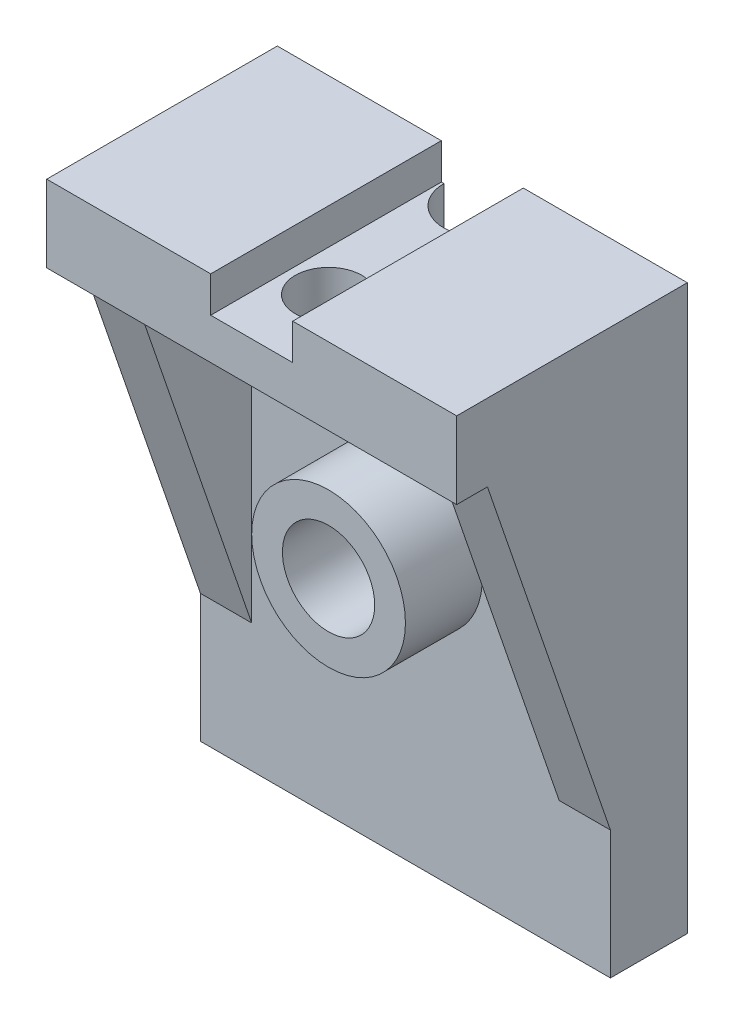
ISO-10303-21;
HEADER;
FILE_DESCRIPTION(('STEP AP214'),'2;1');
FILE_NAME('part.step','',(''),(''),'','','');
FILE_SCHEMA(('AUTOMOTIVE_DESIGN { 1 0 10303 214 1 1 1 1 }'));
ENDSEC;
DATA;
#1=APPLICATION_CONTEXT('core data for automotive mechanical design processes');
#2=APPLICATION_PROTOCOL_DEFINITION('international standard','automotive_design',2000,#1);
#3=PRODUCT_CONTEXT('',#1,'mechanical');
#4=PRODUCT('Part','Part','',(#3));
#5=PRODUCT_RELATED_PRODUCT_CATEGORY('part','',(#4));
#6=PRODUCT_DEFINITION_FORMATION('','',#4);
#7=PRODUCT_DEFINITION_CONTEXT('part definition',#1,'design');
#8=PRODUCT_DEFINITION('design','',#6,#7);
#9=PRODUCT_DEFINITION_SHAPE('','',#8);
#10=(LENGTH_UNIT() NAMED_UNIT(*) SI_UNIT(.MILLI.,.METRE.));
#11=(NAMED_UNIT(*) PLANE_ANGLE_UNIT() SI_UNIT($,.RADIAN.));
#12=(NAMED_UNIT(*) SI_UNIT($,.STERADIAN.) SOLID_ANGLE_UNIT());
#13=UNCERTAINTY_MEASURE_WITH_UNIT(LENGTH_MEASURE(1.E-05),#10,'distance_accuracy_value','');
#14=(GEOMETRIC_REPRESENTATION_CONTEXT(3) GLOBAL_UNCERTAINTY_ASSIGNED_CONTEXT((#13)) GLOBAL_UNIT_ASSIGNED_CONTEXT((#10,
#11,#12)) REPRESENTATION_CONTEXT('',''));
#15=CARTESIAN_POINT('',(0.,0.,0.));
#16=DIRECTION('',(0.,0.,1.));
#17=DIRECTION('',(1.,0.,0.));
#18=AXIS2_PLACEMENT_3D('',#15,#16,#17);
#19=CARTESIAN_POINT('',(-40.,55.,15.));
#20=DIRECTION('',(0.,-1.,0.));
#21=DIRECTION('',(0.,0.,-1.));
#22=AXIS2_PLACEMENT_3D('',#19,#20,#21);
#23=PLANE('',#22);
#24=DIRECTION('',(-1.,0.,0.));
#25=VECTOR('',#24,1.);
#26=CARTESIAN_POINT('',(-40.,55.,0.));
#27=LINE('',#26,#25);
#28=CARTESIAN_POINT('',(40.,55.,0.));
#29=VERTEX_POINT('',#28);
#30=CARTESIAN_POINT('',(8.00000000000001,55.,0.));
#31=VERTEX_POINT('',#30);
#32=EDGE_CURVE('E177',#29,#31,#27,.T.);
#33=ORIENTED_EDGE('',*,*,#32,.T.);
#34=DIRECTION('',(0.,0.,1.));
#35=VECTOR('',#34,1.);
#36=CARTESIAN_POINT('',(8.00000000000001,55.,-0.545006948531608));
#37=LINE('',#36,#35);
#38=CARTESIAN_POINT('',(8.00000000000001,55.,45.));
#39=VERTEX_POINT('',#38);
#40=EDGE_CURVE('E162',#31,#39,#37,.T.);
#41=ORIENTED_EDGE('',*,*,#40,.T.);
#42=DIRECTION('',(-1.,0.,0.));
#43=VECTOR('',#42,1.);
#44=CARTESIAN_POINT('',(40.,55.,45.));
#45=LINE('',#44,#43);
#46=CARTESIAN_POINT('',(40.,55.,45.));
#47=VERTEX_POINT('',#46);
#48=EDGE_CURVE('E175',#47,#39,#45,.T.);
#49=ORIENTED_EDGE('',*,*,#48,.F.);
#50=DIRECTION('',(0.,0.,-1.));
#51=VECTOR('',#50,1.);
#52=CARTESIAN_POINT('',(40.,55.,15.));
#53=LINE('',#52,#51);
#54=EDGE_CURVE('E235',#47,#29,#53,.T.);
#55=ORIENTED_EDGE('',*,*,#54,.T.);
#56=EDGE_LOOP('',(#33,#41,#49,#55));
#57=FACE_BOUND('',#56,.T.);
#58=ADVANCED_FACE('F35',(#57),#23,.F.);
#59=CARTESIAN_POINT('',(0.,0.,0.));
#60=DIRECTION('',(0.,0.,-1.));
#61=DIRECTION('',(-1.,0.,0.));
#62=AXIS2_PLACEMENT_3D('',#59,#60,#61);
#63=PLANE('',#62);
#64=DIRECTION('',(0.,-1.,0.));
#65=VECTOR('',#64,1.);
#66=CARTESIAN_POINT('',(8.00000000000001,0.,0.));
#67=LINE('',#66,#65);
#68=CARTESIAN_POINT('',(8.00000000000001,48.,0.));
#69=VERTEX_POINT('',#68);
#70=EDGE_CURVE('E296',#31,#69,#67,.T.);
#71=ORIENTED_EDGE('',*,*,#70,.F.);
#72=ORIENTED_EDGE('',*,*,#32,.F.);
#73=DIRECTION('',(0.,1.,0.));
#74=VECTOR('',#73,1.);
#75=CARTESIAN_POINT('',(40.,-55.,0.));
#76=LINE('',#75,#74);
#77=CARTESIAN_POINT('',(40.,-55.,0.));
#78=VERTEX_POINT('',#77);
#79=EDGE_CURVE('E215',#78,#29,#76,.T.);
#80=ORIENTED_EDGE('',*,*,#79,.F.);
#81=DIRECTION('',(1.,0.,0.));
#82=VECTOR('',#81,1.);
#83=CARTESIAN_POINT('',(-40.,-55.,0.));
#84=LINE('',#83,#82);
#85=CARTESIAN_POINT('',(7.5,-55.,0.));
#86=VERTEX_POINT('',#85);
#87=EDGE_CURVE('E223',#86,#78,#84,.T.);
#88=ORIENTED_EDGE('',*,*,#87,.F.);
#89=DIRECTION('',(0.,-1.,0.));
#90=VECTOR('',#89,1.);
#91=CARTESIAN_POINT('',(7.5,55.,0.));
#92=LINE('',#91,#90);
#93=CARTESIAN_POINT('',(7.5,-4.9749371855331,0.));
#94=VERTEX_POINT('',#93);
#95=EDGE_CURVE('E307',#94,#86,#92,.T.);
#96=ORIENTED_EDGE('',*,*,#95,.F.);
#97=CARTESIAN_POINT('',(0.,0.,0.));
#98=DIRECTION('',(0.,0.,1.));
#99=DIRECTION('',(1.,0.,0.));
#100=AXIS2_PLACEMENT_3D('',#97,#98,#99);
#101=CIRCLE('',#100,9.);
#102=CARTESIAN_POINT('',(7.5,4.9749371855331,0.));
#103=VERTEX_POINT('',#102);
#104=EDGE_CURVE('E315',#94,#103,#101,.T.);
#105=ORIENTED_EDGE('',*,*,#104,.T.);
#106=CARTESIAN_POINT('',(7.5,48.,0.));
#107=VERTEX_POINT('',#106);
#108=EDGE_CURVE('E310',#107,#103,#92,.T.);
#109=ORIENTED_EDGE('',*,*,#108,.F.);
#110=DIRECTION('',(-1.,0.,0.));
#111=VECTOR('',#110,1.);
#112=CARTESIAN_POINT('',(0.,48.,0.));
#113=LINE('',#112,#111);
#114=EDGE_CURVE('E50',#69,#107,#113,.T.);
#115=ORIENTED_EDGE('',*,*,#114,.F.);
#116=EDGE_LOOP('',(#71,#72,#80,#88,#96,#105,#109,#115));
#117=FACE_BOUND('',#116,.T.);
#118=ADVANCED_FACE('F294',(#117),#63,.T.);
#119=CARTESIAN_POINT('',(0.,0.,15.));
#120=DIRECTION('',(0.,0.,-1.));
#121=DIRECTION('',(-1.,0.,0.));
#122=AXIS2_PLACEMENT_3D('',#119,#120,#121);
#123=PLANE('',#122);
#124=DIRECTION('',(-1.,0.,0.));
#125=VECTOR('',#124,1.);
#126=CARTESIAN_POINT('',(-30.,-30.,15.));
#127=LINE('',#126,#125);
#128=CARTESIAN_POINT('',(-30.,-30.,15.));
#129=VERTEX_POINT('',#128);
#130=CARTESIAN_POINT('',(-40.,-30.,15.));
#131=VERTEX_POINT('',#130);
#132=EDGE_CURVE('E268',#129,#131,#127,.T.);
#133=ORIENTED_EDGE('',*,*,#132,.T.);
#134=DIRECTION('',(0.,-1.,0.));
#135=VECTOR('',#134,1.);
#136=CARTESIAN_POINT('',(-40.,-55.,15.));
#137=LINE('',#136,#135);
#138=CARTESIAN_POINT('',(-40.,-55.,15.));
#139=VERTEX_POINT('',#138);
#140=EDGE_CURVE('E205',#131,#139,#137,.T.);
#141=ORIENTED_EDGE('',*,*,#140,.T.);
#142=DIRECTION('',(1.,0.,0.));
#143=VECTOR('',#142,1.);
#144=CARTESIAN_POINT('',(-40.,-55.,15.));
#145=LINE('',#144,#143);
#146=CARTESIAN_POINT('',(40.,-55.,15.));
#147=VERTEX_POINT('',#146);
#148=EDGE_CURVE('E207',#139,#147,#145,.T.);
#149=ORIENTED_EDGE('',*,*,#148,.T.);
#150=DIRECTION('',(0.,1.,0.));
#151=VECTOR('',#150,1.);
#152=CARTESIAN_POINT('',(40.,-55.,15.));
#153=LINE('',#152,#151);
#154=CARTESIAN_POINT('',(40.,-30.,15.));
#155=VERTEX_POINT('',#154);
#156=EDGE_CURVE('E208',#147,#155,#153,.T.);
#157=ORIENTED_EDGE('',*,*,#156,.T.);
#158=DIRECTION('',(1.,0.,0.));
#159=VECTOR('',#158,1.);
#160=CARTESIAN_POINT('',(30.,-30.,15.));
#161=LINE('',#160,#159);
#162=CARTESIAN_POINT('',(30.,-30.,15.));
#163=VERTEX_POINT('',#162);
#164=EDGE_CURVE('E202',#163,#155,#161,.T.);
#165=ORIENTED_EDGE('',*,*,#164,.F.);
#166=DIRECTION('',(0.,1.,0.));
#167=VECTOR('',#166,1.);
#168=CARTESIAN_POINT('',(30.,-30.,15.));
#169=LINE('',#168,#167);
#170=CARTESIAN_POINT('',(30.,40.,15.));
#171=VERTEX_POINT('',#170);
#172=EDGE_CURVE('E280',#163,#171,#169,.T.);
#173=ORIENTED_EDGE('',*,*,#172,.T.);
#174=DIRECTION('',(1.,0.,0.));
#175=VECTOR('',#174,1.);
#176=CARTESIAN_POINT('',(40.,40.,15.));
#177=LINE('',#176,#175);
#178=CARTESIAN_POINT('',(-30.,40.,15.));
#179=VERTEX_POINT('',#178);
#180=EDGE_CURVE('E199',#179,#171,#177,.T.);
#181=ORIENTED_EDGE('',*,*,#180,.F.);
#182=DIRECTION('',(0.,1.,0.));
#183=VECTOR('',#182,1.);
#184=CARTESIAN_POINT('',(-30.,-30.,15.));
#185=LINE('',#184,#183);
#186=EDGE_CURVE('E324',#129,#179,#185,.T.);
#187=ORIENTED_EDGE('',*,*,#186,.F.);
#188=EDGE_LOOP('',(#133,#141,#149,#157,#165,#173,#181,#187));
#189=FACE_BOUND('',#188,.T.);
#190=CARTESIAN_POINT('',(0.,0.,15.));
#191=DIRECTION('',(0.,0.,-1.));
#192=DIRECTION('',(-1.,0.,0.));
#193=AXIS2_PLACEMENT_3D('',#190,#191,#192);
#194=CIRCLE('',#193,15.);
#195=CARTESIAN_POINT('',(-15.,0.,15.));
#196=VERTEX_POINT('',#195);
#197=EDGE_CURVE('E209',#196,#196,#194,.F.);
#198=ORIENTED_EDGE('',*,*,#197,.F.);
#199=EDGE_LOOP('',(#198));
#200=FACE_BOUND('',#199,.T.);
#201=ADVANCED_FACE('F329',(#189,#200),#123,.F.);
#202=CARTESIAN_POINT('',(40.,40.,45.));
#203=DIRECTION('',(0.,1.,0.));
#204=DIRECTION('',(-1.,0.,0.));
#205=AXIS2_PLACEMENT_3D('',#202,#203,#204);
#206=PLANE('',#205);
#207=CARTESIAN_POINT('',(0.,40.,30.));
#208=DIRECTION('',(0.,-1.,0.));
#209=DIRECTION('',(1.,0.,0.));
#210=AXIS2_PLACEMENT_3D('',#207,#208,#209);
#211=CIRCLE('',#210,6.5);
#212=CARTESIAN_POINT('',(6.49999999999999,40.,30.));
#213=VERTEX_POINT('',#212);
#214=EDGE_CURVE('E311',#213,#213,#211,.T.);
#215=ORIENTED_EDGE('',*,*,#214,.F.);
#216=EDGE_LOOP('',(#215));
#217=FACE_BOUND('',#216,.T.);
#218=DIRECTION('',(-1.,0.,0.));
#219=VECTOR('',#218,1.);
#220=CARTESIAN_POINT('',(-30.,40.,39.));
#221=LINE('',#220,#219);
#222=CARTESIAN_POINT('',(-30.,40.,39.));
#223=VERTEX_POINT('',#222);
#224=CARTESIAN_POINT('',(-40.,40.,39.));
#225=VERTEX_POINT('',#224);
#226=EDGE_CURVE('E248',#223,#225,#221,.T.);
#227=ORIENTED_EDGE('',*,*,#226,.F.);
#228=DIRECTION('',(0.,0.,1.));
#229=VECTOR('',#228,1.);
#230=CARTESIAN_POINT('',(-30.,40.,15.));
#231=LINE('',#230,#229);
#232=EDGE_CURVE('E260',#179,#223,#231,.T.);
#233=ORIENTED_EDGE('',*,*,#232,.F.);
#234=ORIENTED_EDGE('',*,*,#180,.T.);
#235=DIRECTION('',(0.,0.,1.));
#236=VECTOR('',#235,1.);
#237=CARTESIAN_POINT('',(30.,40.,15.));
#238=LINE('',#237,#236);
#239=CARTESIAN_POINT('',(30.,40.,39.));
#240=VERTEX_POINT('',#239);
#241=EDGE_CURVE('E271',#171,#240,#238,.T.);
#242=ORIENTED_EDGE('',*,*,#241,.T.);
#243=DIRECTION('',(1.,0.,0.));
#244=VECTOR('',#243,1.);
#245=CARTESIAN_POINT('',(30.,40.,39.));
#246=LINE('',#245,#244);
#247=CARTESIAN_POINT('',(40.,40.,39.));
#248=VERTEX_POINT('',#247);
#249=EDGE_CURVE('E282',#240,#248,#246,.T.);
#250=ORIENTED_EDGE('',*,*,#249,.T.);
#251=DIRECTION('',(0.,0.,-1.));
#252=VECTOR('',#251,1.);
#253=CARTESIAN_POINT('',(40.,40.,45.));
#254=LINE('',#253,#252);
#255=CARTESIAN_POINT('',(40.,40.,45.));
#256=VERTEX_POINT('',#255);
#257=EDGE_CURVE('E193',#256,#248,#254,.T.);
#258=ORIENTED_EDGE('',*,*,#257,.F.);
#259=DIRECTION('',(1.,0.,0.));
#260=VECTOR('',#259,1.);
#261=CARTESIAN_POINT('',(40.,40.,45.));
#262=LINE('',#261,#260);
#263=CARTESIAN_POINT('',(-40.,40.,45.));
#264=VERTEX_POINT('',#263);
#265=EDGE_CURVE('E187',#264,#256,#262,.T.);
#266=ORIENTED_EDGE('',*,*,#265,.F.);
#267=DIRECTION('',(0.,0.,-1.));
#268=VECTOR('',#267,1.);
#269=CARTESIAN_POINT('',(-40.,40.,45.));
#270=LINE('',#269,#268);
#271=EDGE_CURVE('E219',#264,#225,#270,.T.);
#272=ORIENTED_EDGE('',*,*,#271,.T.);
#273=EDGE_LOOP('',(#227,#233,#234,#242,#250,#258,#266,#272));
#274=FACE_BOUND('',#273,.T.);
#275=ADVANCED_FACE('F246',(#217,#274),#206,.F.);
#276=CARTESIAN_POINT('',(40.,-55.,15.));
#277=DIRECTION('',(-1.,0.,0.));
#278=DIRECTION('',(0.,0.,1.));
#279=AXIS2_PLACEMENT_3D('',#276,#277,#278);
#280=PLANE('',#279);
#281=ORIENTED_EDGE('',*,*,#79,.T.);
#282=ORIENTED_EDGE('',*,*,#54,.F.);
#283=DIRECTION('',(0.,1.,0.));
#284=VECTOR('',#283,1.);
#285=CARTESIAN_POINT('',(40.,55.,45.));
#286=LINE('',#285,#284);
#287=EDGE_CURVE('E183',#256,#47,#286,.T.);
#288=ORIENTED_EDGE('',*,*,#287,.F.);
#289=ORIENTED_EDGE('',*,*,#257,.T.);
#290=DIRECTION('',(0.,-0.945945945945946,-0.324324324324324));
#291=VECTOR('',#290,1.);
#292=CARTESIAN_POINT('',(40.,40.,39.));
#293=LINE('',#292,#291);
#294=EDGE_CURVE('E267',#248,#155,#293,.T.);
#295=ORIENTED_EDGE('',*,*,#294,.T.);
#296=ORIENTED_EDGE('',*,*,#156,.F.);
#297=DIRECTION('',(0.,0.,-1.));
#298=VECTOR('',#297,1.);
#299=CARTESIAN_POINT('',(40.,-55.,15.));
#300=LINE('',#299,#298);
#301=EDGE_CURVE('E214',#147,#78,#300,.T.);
#302=ORIENTED_EDGE('',*,*,#301,.T.);
#303=EDGE_LOOP('',(#281,#282,#288,#289,#295,#296,#302));
#304=FACE_BOUND('',#303,.T.);
#305=ADVANCED_FACE('F37',(#304),#280,.F.);
#306=CARTESIAN_POINT('',(-7.99999999999999,55.,45.));
#307=VERTEX_POINT('',#306);
#308=CARTESIAN_POINT('',(-40.,55.,45.));
#309=VERTEX_POINT('',#308);
#310=EDGE_CURVE('E185',#307,#309,#45,.T.);
#311=ORIENTED_EDGE('',*,*,#310,.F.);
#312=DIRECTION('',(0.,0.,1.));
#313=VECTOR('',#312,1.);
#314=CARTESIAN_POINT('',(-7.99999999999999,55.,-0.545006948531608));
#315=LINE('',#314,#313);
#316=CARTESIAN_POINT('',(-7.99999999999999,55.,0.));
#317=VERTEX_POINT('',#316);
#318=EDGE_CURVE('E178',#317,#307,#315,.T.);
#319=ORIENTED_EDGE('',*,*,#318,.F.);
#320=CARTESIAN_POINT('',(-40.,55.,0.));
#321=VERTEX_POINT('',#320);
#322=EDGE_CURVE('E218',#317,#321,#27,.T.);
#323=ORIENTED_EDGE('',*,*,#322,.T.);
#324=DIRECTION('',(0.,0.,-1.));
#325=VECTOR('',#324,1.);
#326=CARTESIAN_POINT('',(-40.,55.,15.));
#327=LINE('',#326,#325);
#328=EDGE_CURVE('E232',#309,#321,#327,.T.);
#329=ORIENTED_EDGE('',*,*,#328,.F.);
#330=EDGE_LOOP('',(#311,#319,#323,#329));
#331=FACE_BOUND('',#330,.T.);
#332=ADVANCED_FACE('F385',(#331),#23,.F.);
#333=CARTESIAN_POINT('',(-40.,-55.,15.));
#334=DIRECTION('',(1.,0.,0.));
#335=DIRECTION('',(0.,0.,-1.));
#336=AXIS2_PLACEMENT_3D('',#333,#334,#335);
#337=PLANE('',#336);
#338=ORIENTED_EDGE('',*,*,#140,.F.);
#339=DIRECTION('',(0.,-0.945945945945946,-0.324324324324324));
#340=VECTOR('',#339,1.);
#341=CARTESIAN_POINT('',(-40.,40.,39.));
#342=LINE('',#341,#340);
#343=EDGE_CURVE('E255',#225,#131,#342,.T.);
#344=ORIENTED_EDGE('',*,*,#343,.F.);
#345=ORIENTED_EDGE('',*,*,#271,.F.);
#346=DIRECTION('',(0.,-1.,0.));
#347=VECTOR('',#346,1.);
#348=CARTESIAN_POINT('',(-40.,55.,45.));
#349=LINE('',#348,#347);
#350=EDGE_CURVE('E184',#309,#264,#349,.T.);
#351=ORIENTED_EDGE('',*,*,#350,.F.);
#352=ORIENTED_EDGE('',*,*,#328,.T.);
#353=DIRECTION('',(0.,-1.,0.));
#354=VECTOR('',#353,1.);
#355=CARTESIAN_POINT('',(-40.,-55.,0.));
#356=LINE('',#355,#354);
#357=CARTESIAN_POINT('',(-40.,-55.,0.));
#358=VERTEX_POINT('',#357);
#359=EDGE_CURVE('E221',#321,#358,#356,.T.);
#360=ORIENTED_EDGE('',*,*,#359,.T.);
#361=DIRECTION('',(0.,0.,-1.));
#362=VECTOR('',#361,1.);
#363=CARTESIAN_POINT('',(-40.,-55.,15.));
#364=LINE('',#363,#362);
#365=EDGE_CURVE('E229',#139,#358,#364,.T.);
#366=ORIENTED_EDGE('',*,*,#365,.F.);
#367=EDGE_LOOP('',(#338,#344,#345,#351,#352,#360,#366));
#368=FACE_BOUND('',#367,.T.);
#369=ADVANCED_FACE('F256',(#368),#337,.F.);
#370=CARTESIAN_POINT('',(-40.,-55.,15.));
#371=DIRECTION('',(0.,1.,0.));
#372=DIRECTION('',(0.,0.,1.));
#373=AXIS2_PLACEMENT_3D('',#370,#371,#372);
#374=PLANE('',#373);
#375=CARTESIAN_POINT('',(-7.5,-55.,0.));
#376=VERTEX_POINT('',#375);
#377=EDGE_CURVE('E224',#358,#376,#84,.T.);
#378=ORIENTED_EDGE('',*,*,#377,.T.);
#379=CARTESIAN_POINT('',(0.,-55.,0.));
#380=DIRECTION('',(0.,-1.,0.));
#381=DIRECTION('',(0.,0.,-1.));
#382=AXIS2_PLACEMENT_3D('',#379,#380,#381);
#383=CIRCLE('',#382,7.5);
#384=EDGE_CURVE('E298',#86,#376,#383,.T.);
#385=ORIENTED_EDGE('',*,*,#384,.F.);
#386=ORIENTED_EDGE('',*,*,#87,.T.);
#387=ORIENTED_EDGE('',*,*,#301,.F.);
#388=ORIENTED_EDGE('',*,*,#148,.F.);
#389=ORIENTED_EDGE('',*,*,#365,.T.);
#390=EDGE_LOOP('',(#378,#385,#386,#387,#388,#389));
#391=FACE_BOUND('',#390,.T.);
#392=ADVANCED_FACE('F339',(#391),#374,.F.);
#393=DIRECTION('',(-1.,0.,0.));
#394=VECTOR('',#393,1.);
#395=CARTESIAN_POINT('',(0.,48.,0.));
#396=LINE('',#395,#394);
#397=CARTESIAN_POINT('',(-7.5,48.,0.));
#398=VERTEX_POINT('',#397);
#399=CARTESIAN_POINT('',(-7.99999999999999,48.,0.));
#400=VERTEX_POINT('',#399);
#401=EDGE_CURVE('E409',#398,#400,#396,.T.);
#402=ORIENTED_EDGE('',*,*,#401,.F.);
#403=DIRECTION('',(0.,-1.,0.));
#404=VECTOR('',#403,1.);
#405=CARTESIAN_POINT('',(-7.5,55.,0.));
#406=LINE('',#405,#404);
#407=CARTESIAN_POINT('',(-7.5,4.9749371855331,0.));
#408=VERTEX_POINT('',#407);
#409=EDGE_CURVE('E308',#408,#398,#406,.F.);
#410=ORIENTED_EDGE('',*,*,#409,.F.);
#411=CARTESIAN_POINT('',(-7.5,-4.9749371855331,0.));
#412=VERTEX_POINT('',#411);
#413=EDGE_CURVE('E318',#408,#412,#101,.T.);
#414=ORIENTED_EDGE('',*,*,#413,.T.);
#415=EDGE_CURVE('E57',#376,#412,#406,.F.);
#416=ORIENTED_EDGE('',*,*,#415,.F.);
#417=ORIENTED_EDGE('',*,*,#377,.F.);
#418=ORIENTED_EDGE('',*,*,#359,.F.);
#419=ORIENTED_EDGE('',*,*,#322,.F.);
#420=DIRECTION('',(0.,1.,0.));
#421=VECTOR('',#420,1.);
#422=CARTESIAN_POINT('',(-7.99999999999999,0.,0.));
#423=LINE('',#422,#421);
#424=EDGE_CURVE('E299',#400,#317,#423,.T.);
#425=ORIENTED_EDGE('',*,*,#424,.F.);
#426=EDGE_LOOP('',(#402,#410,#414,#416,#417,#418,#419,#425));
#427=FACE_BOUND('',#426,.T.);
#428=ADVANCED_FACE('F346',(#427),#63,.T.);
#429=CARTESIAN_POINT('',(0.,0.,45.));
#430=DIRECTION('',(0.,0.,-1.));
#431=DIRECTION('',(-1.,0.,0.));
#432=AXIS2_PLACEMENT_3D('',#429,#430,#431);
#433=PLANE('',#432);
#434=ORIENTED_EDGE('',*,*,#48,.T.);
#435=DIRECTION('',(0.,1.,0.));
#436=VECTOR('',#435,1.);
#437=CARTESIAN_POINT('',(8.00000000000001,48.,45.));
#438=LINE('',#437,#436);
#439=CARTESIAN_POINT('',(8.00000000000001,48.,45.));
#440=VERTEX_POINT('',#439);
#441=EDGE_CURVE('E159',#440,#39,#438,.T.);
#442=ORIENTED_EDGE('',*,*,#441,.F.);
#443=DIRECTION('',(1.,0.,0.));
#444=VECTOR('',#443,1.);
#445=CARTESIAN_POINT('',(-7.99999999999999,48.,45.));
#446=LINE('',#445,#444);
#447=CARTESIAN_POINT('',(-7.99999999999999,48.,45.));
#448=VERTEX_POINT('',#447);
#449=EDGE_CURVE('E179',#448,#440,#446,.T.);
#450=ORIENTED_EDGE('',*,*,#449,.F.);
#451=DIRECTION('',(0.,-1.,0.));
#452=VECTOR('',#451,1.);
#453=CARTESIAN_POINT('',(-7.99999999999999,48.,45.));
#454=LINE('',#453,#452);
#455=EDGE_CURVE('E169',#307,#448,#454,.T.);
#456=ORIENTED_EDGE('',*,*,#455,.F.);
#457=ORIENTED_EDGE('',*,*,#310,.T.);
#458=ORIENTED_EDGE('',*,*,#350,.T.);
#459=ORIENTED_EDGE('',*,*,#265,.T.);
#460=ORIENTED_EDGE('',*,*,#287,.T.);
#461=EDGE_LOOP('',(#434,#442,#450,#456,#457,#458,#459,#460));
#462=FACE_BOUND('',#461,.T.);
#463=ADVANCED_FACE('F181',(#462),#433,.F.);
#464=CARTESIAN_POINT('',(30.,40.,39.));
#465=DIRECTION('',(0.,-0.324324324324324,0.945945945945946));
#466=DIRECTION('',(0.,-0.945945945945946,-0.324324324324324));
#467=AXIS2_PLACEMENT_3D('',#464,#465,#466);
#468=PLANE('',#467);
#469=ORIENTED_EDGE('',*,*,#294,.F.);
#470=ORIENTED_EDGE('',*,*,#249,.F.);
#471=DIRECTION('',(0.,-0.945945945945946,-0.324324324324324));
#472=VECTOR('',#471,1.);
#473=CARTESIAN_POINT('',(30.,40.,39.));
#474=LINE('',#473,#472);
#475=EDGE_CURVE('E278',#240,#163,#474,.T.);
#476=ORIENTED_EDGE('',*,*,#475,.T.);
#477=ORIENTED_EDGE('',*,*,#164,.T.);
#478=EDGE_LOOP('',(#469,#470,#476,#477));
#479=FACE_BOUND('',#478,.T.);
#480=ADVANCED_FACE('F336',(#479),#468,.T.);
#481=CARTESIAN_POINT('',(30.,0.,0.));
#482=DIRECTION('',(-1.,0.,0.));
#483=DIRECTION('',(0.,0.,1.));
#484=AXIS2_PLACEMENT_3D('',#481,#482,#483);
#485=PLANE('',#484);
#486=ORIENTED_EDGE('',*,*,#241,.F.);
#487=ORIENTED_EDGE('',*,*,#172,.F.);
#488=ORIENTED_EDGE('',*,*,#475,.F.);
#489=EDGE_LOOP('',(#486,#487,#488));
#490=FACE_BOUND('',#489,.T.);
#491=ADVANCED_FACE('F335',(#490),#485,.T.);
#492=CARTESIAN_POINT('',(-30.,40.,39.));
#493=DIRECTION('',(0.,0.324324324324324,-0.945945945945946));
#494=DIRECTION('',(0.,0.945945945945946,0.324324324324324));
#495=AXIS2_PLACEMENT_3D('',#492,#493,#494);
#496=PLANE('',#495);
#497=ORIENTED_EDGE('',*,*,#343,.T.);
#498=ORIENTED_EDGE('',*,*,#132,.F.);
#499=DIRECTION('',(0.,-0.945945945945946,-0.324324324324324));
#500=VECTOR('',#499,1.);
#501=CARTESIAN_POINT('',(-30.,40.,39.));
#502=LINE('',#501,#500);
#503=EDGE_CURVE('E265',#223,#129,#502,.T.);
#504=ORIENTED_EDGE('',*,*,#503,.F.);
#505=ORIENTED_EDGE('',*,*,#226,.T.);
#506=EDGE_LOOP('',(#497,#498,#504,#505));
#507=FACE_BOUND('',#506,.T.);
#508=ADVANCED_FACE('F263',(#507),#496,.F.);
#509=CARTESIAN_POINT('',(-30.,0.,0.));
#510=DIRECTION('',(1.,0.,0.));
#511=DIRECTION('',(0.,0.,1.));
#512=AXIS2_PLACEMENT_3D('',#509,#510,#511);
#513=PLANE('',#512);
#514=ORIENTED_EDGE('',*,*,#232,.T.);
#515=ORIENTED_EDGE('',*,*,#503,.T.);
#516=ORIENTED_EDGE('',*,*,#186,.T.);
#517=EDGE_LOOP('',(#514,#515,#516));
#518=FACE_BOUND('',#517,.T.);
#519=ADVANCED_FACE('F327',(#518),#513,.T.);
#520=CARTESIAN_POINT('',(0.,0.,30.));
#521=DIRECTION('',(0.,0.,-1.));
#522=DIRECTION('',(-1.,0.,0.));
#523=AXIS2_PLACEMENT_3D('',#520,#521,#522);
#524=CYLINDRICAL_SURFACE('',#523,15.);
#525=CARTESIAN_POINT('',(0.,0.,30.));
#526=DIRECTION('',(0.,0.,1.));
#527=DIRECTION('',(1.,0.,0.));
#528=AXIS2_PLACEMENT_3D('',#525,#526,#527);
#529=CIRCLE('',#528,15.);
#530=CARTESIAN_POINT('',(15.,0.,30.));
#531=VERTEX_POINT('',#530);
#532=EDGE_CURVE('E261',#531,#531,#529,.T.);
#533=ORIENTED_EDGE('',*,*,#532,.F.);
#534=EDGE_LOOP('',(#533));
#535=FACE_BOUND('',#534,.T.);
#536=ORIENTED_EDGE('',*,*,#197,.T.);
#537=EDGE_LOOP('',(#536));
#538=FACE_BOUND('',#537,.T.);
#539=ADVANCED_FACE('F524',(#535,#538),#524,.T.);
#540=CARTESIAN_POINT('',(0.,0.,30.));
#541=DIRECTION('',(0.,0.,1.));
#542=DIRECTION('',(1.,0.,0.));
#543=AXIS2_PLACEMENT_3D('',#540,#541,#542);
#544=PLANE('',#543);
#545=CARTESIAN_POINT('',(0.,0.,30.));
#546=DIRECTION('',(0.,0.,1.));
#547=DIRECTION('',(1.,0.,0.));
#548=AXIS2_PLACEMENT_3D('',#545,#546,#547);
#549=CIRCLE('',#548,9.);
#550=CARTESIAN_POINT('',(9.,0.,30.));
#551=VERTEX_POINT('',#550);
#552=EDGE_CURVE('E314',#551,#551,#549,.T.);
#553=ORIENTED_EDGE('',*,*,#552,.F.);
#554=EDGE_LOOP('',(#553));
#555=FACE_BOUND('',#554,.T.);
#556=ORIENTED_EDGE('',*,*,#532,.T.);
#557=EDGE_LOOP('',(#556));
#558=FACE_BOUND('',#557,.T.);
#559=ADVANCED_FACE('F381',(#555,#558),#544,.T.);
#560=CARTESIAN_POINT('',(0.,0.,0.));
#561=DIRECTION('',(0.,0.,1.));
#562=DIRECTION('',(1.,0.,0.));
#563=AXIS2_PLACEMENT_3D('',#560,#561,#562);
#564=CYLINDRICAL_SURFACE('',#563,9.);
#565=ORIENTED_EDGE('',*,*,#413,.F.);
#566=CARTESIAN_POINT('',(-7.5,4.9749371855331,0.));
#567=CARTESIAN_POINT('',(-7.50003186296583,4.97484070743312,0.134001990995259));
#568=CARTESIAN_POINT('',(-7.49641021393228,4.9803488265491,0.267943594245668));
#569=CARTESIAN_POINT('',(-7.48211823694103,5.00181952312662,0.534356857620681));
#570=CARTESIAN_POINT('',(-7.47146149752148,5.01776194583606,0.666830851914528));
#571=CARTESIAN_POINT('',(-7.44356193775105,5.05904693845857,0.927558808135591));
#572=CARTESIAN_POINT('',(-7.42641797128328,5.08424825929271,1.05584616557558));
#573=CARTESIAN_POINT('',(-7.38590407633787,5.14292708704883,1.30955349631114));
#574=CARTESIAN_POINT('',(-7.36253070080152,5.17640917541258,1.43497184018116));
#575=CARTESIAN_POINT('',(-7.29951341254342,5.26508394977622,1.73156950613735));
#576=CARTESIAN_POINT('',(-7.25709345872007,5.32361971387735,1.90116047469769));
#577=CARTESIAN_POINT('',(-7.16184822340055,5.45107846283526,2.23334321964724));
#578=CARTESIAN_POINT('',(-7.10901875804006,5.52000562164968,2.39593214960328));
#579=CARTESIAN_POINT('',(-6.99327229802293,5.6659403571164,2.71536794548079));
#580=CARTESIAN_POINT('',(-6.9302804631323,5.74300629219599,2.87216069196773));
#581=CARTESIAN_POINT('',(-6.79503119393943,5.9024142643672,3.17894002789376));
#582=CARTESIAN_POINT('',(-6.72277077871729,5.98475799459866,3.32892440655221));
#583=CARTESIAN_POINT('',(-6.53539518705707,6.18995106838464,3.68722975304455));
#584=CARTESIAN_POINT('',(-6.41546180031687,6.31460689707292,3.89201096210577));
#585=CARTESIAN_POINT('',(-6.1575682025695,6.56634480152976,4.28838735132891));
#586=CARTESIAN_POINT('',(-6.01960038330015,6.69342788186273,4.47997691389866));
#587=CARTESIAN_POINT('',(-5.72614243454771,6.94612950799354,4.84941352525665));
#588=CARTESIAN_POINT('',(-5.57069104197518,7.07175063662362,5.02728953859146));
#589=CARTESIAN_POINT('',(-5.24207633880843,7.31866497859598,5.36905893536878));
#590=CARTESIAN_POINT('',(-5.06891976968495,7.43995981567522,5.53295759758983));
#591=CARTESIAN_POINT('',(-4.74346165266498,7.65041019629241,5.81251523966197));
#592=CARTESIAN_POINT('',(-4.59450191247293,7.74093486126354,5.93104255231505));
#593=CARTESIAN_POINT('',(-4.2857195222723,7.91606572234604,6.15786423344467));
#594=CARTESIAN_POINT('',(-4.12589911422016,8.00067313267689,6.26616070289756));
#595=CARTESIAN_POINT('',(-3.79581496442624,8.16244680399926,6.47143899633763));
#596=CARTESIAN_POINT('',(-3.62556189830121,8.23962047048292,6.56843210138004));
#597=CARTESIAN_POINT('',(-3.27498054601227,8.38513558733439,6.75007059156782));
#598=CARTESIAN_POINT('',(-3.09465409732517,8.45347864100018,6.83471821853517));
#599=CARTESIAN_POINT('',(-2.75673992298283,8.56892793464225,6.97695759713911));
#600=CARTESIAN_POINT('',(-2.60061025844702,8.61766301493934,7.03669688391294));
#601=CARTESIAN_POINT('',(-2.28269692873167,8.70727020054532,7.14615582351264));
#602=CARTESIAN_POINT('',(-2.12091441485946,8.74814389606691,7.19587750281207));
#603=CARTESIAN_POINT('',(-1.79259014148996,8.82127504990615,7.28460874967633));
#604=CARTESIAN_POINT('',(-1.62605021507107,8.85353577860837,7.32362238329545));
#605=CARTESIAN_POINT('',(-1.28920142578853,8.90882070555354,7.39036102944622));
#606=CARTESIAN_POINT('',(-1.11889251956949,8.93184479748716,7.41808591204972));
#607=CARTESIAN_POINT('',(-0.775007179103727,8.96824303588694,7.46187189864985));
#608=CARTESIAN_POINT('',(-0.601419920925718,8.98157568306602,7.47788284481953));
#609=CARTESIAN_POINT('',(-0.253066812504965,8.99813100037003,7.49775912547318));
#610=CARTESIAN_POINT('',(-0.0783009598333194,9.00135364965342,7.50162443491919));
#611=CARTESIAN_POINT('',(0.270960419875989,8.99761527450609,7.49713825847281));
#612=CARTESIAN_POINT('',(0.445455950811263,8.99065439829981,7.48878695039717));
#613=CARTESIAN_POINT('',(0.792746952188123,8.96670770115939,7.4600208138054));
#614=CARTESIAN_POINT('',(0.965542480499856,8.94972222268372,7.43960639738673));
#615=CARTESIAN_POINT('',(1.29653223944862,8.90757747068737,7.38885115858182));
#616=CARTESIAN_POINT('',(1.45492503920525,8.88304698098231,7.35927297292158));
#617=CARTESIAN_POINT('',(1.76816479221963,8.82603803049746,7.29035814678811));
#618=CARTESIAN_POINT('',(1.92301051889069,8.79355686440671,7.25101818469319));
#619=CARTESIAN_POINT('',(2.22823270341585,8.72121346570153,7.16311306622089));
#620=CARTESIAN_POINT('',(2.3786105826358,8.6813536103062,7.11455088087063));
#621=CARTESIAN_POINT('',(2.67431187357802,8.59487209667859,7.00876228121276));
#622=CARTESIAN_POINT('',(2.81963338554144,8.54824793028252,6.95153265272496));
#623=CARTESIAN_POINT('',(3.27143061761862,8.39075747559207,6.75728637310359));
#624=CARTESIAN_POINT('',(3.56765930761453,8.26851834102233,6.60522025899359));
#625=CARTESIAN_POINT('',(4.1304151927159,8.00230368694447,6.26877094501638));
#626=CARTESIAN_POINT('',(4.39691563986042,7.85830886265308,6.08435901966039));
#627=CARTESIAN_POINT('',(4.83318660555159,7.59520494221609,5.73986318960137));
#628=CARTESIAN_POINT('',(5.01001964770353,7.47944490468915,5.5860422923845));
#629=CARTESIAN_POINT('',(5.34683380259963,7.24249744695316,5.26456076128903));
#630=CARTESIAN_POINT('',(5.50680718420173,7.12130757283398,5.09689384050999));
#631=CARTESIAN_POINT('',(5.8100306497335,6.87616296814012,4.74836804678429));
#632=CARTESIAN_POINT('',(5.95325317646523,6.75220407027281,4.56748820943349));
#633=CARTESIAN_POINT('',(6.22258885698959,6.50482692616791,4.19315507653392));
#634=CARTESIAN_POINT('',(6.34870818724278,6.38140850041512,3.99970635750243));
#635=CARTESIAN_POINT('',(6.55231548517458,6.17110480219335,3.65322813931712));
#636=CARTESIAN_POINT('',(6.63381424578585,6.08323659214459,3.50313969222721));
#637=CARTESIAN_POINT('',(6.7872083592634,5.91160197448636,3.19582681297625));
#638=CARTESIAN_POINT('',(6.85910305310332,5.82783584860944,3.03860189210463));
#639=CARTESIAN_POINT('',(6.99269851787439,5.66684088842958,2.7170556260477));
#640=CARTESIAN_POINT('',(7.05442031557866,5.58959873487462,2.55274982700173));
#641=CARTESIAN_POINT('',(7.16713396260135,5.44432141747091,2.21667297576416));
#642=CARTESIAN_POINT('',(7.2181312100392,5.37628162786783,2.04490573201958));
#643=CARTESIAN_POINT('',(7.3256258010235,5.22937712446449,1.62711321587923));
#644=CARTESIAN_POINT('',(7.3769035742131,5.15615702845478,1.37758125388722));
#645=CARTESIAN_POINT('',(7.43478480684473,5.07199388495963,0.995284062751673));
#646=CARTESIAN_POINT('',(7.45089785540234,5.04823078335514,0.866680642470898));
#647=CARTESIAN_POINT('',(7.47649162252587,5.01025038406567,0.607443991541746));
#648=CARTESIAN_POINT('',(7.48597703188951,4.99602633527941,0.476812263529275));
#649=CARTESIAN_POINT('',(7.49468135682623,4.98294782599432,0.288223668456119));
#650=CARTESIAN_POINT('',(7.49667431820265,4.97994794627177,0.23064750749038));
#651=CARTESIAN_POINT('',(7.49933389121744,4.97594165648954,0.11538396869512));
#652=CARTESIAN_POINT('',(7.5000002398885,4.97493564166318,0.0576965710837617));
#653=CARTESIAN_POINT('',(7.5,4.9749371855331,0.));
#654=B_SPLINE_CURVE_WITH_KNOTS('',3,(#566,#567,#568,#569,#570,#571,#572,#573,#574,#575,#576,
#577,#578,#579,#580,#581,#582,#583,#584,#585,#586,#587,#588,#589,#590,#591,#592,#593,#594,#595,
#596,#597,#598,#599,#600,#601,#602,#603,#604,#605,#606,#607,#608,#609,#610,#611,#612,#613,#614,
#615,#616,#617,#618,#619,#620,#621,#622,#623,#624,#625,#626,#627,#628,#629,#630,#631,#632,#633,
#634,#635,#636,#637,#638,#639,#640,#641,#642,#643,#644,#645,#646,#647,#648,#649,#650,#651,#652,
#653),.UNSPECIFIED.,.F.,.F.,(4,2,2,2,2,2,2,2,2,2,2,2,2,2,2,2,2,2,2,2,2,2,2,2,2,2,2,2,2,2,2,2,2,
2,2,2,2,2,2,2,2,2,2,4),(0.,0.401747428534645,0.802721128603126,1.19781587782892,
1.59312970926017,2.14529790311229,2.69768848267379,3.2543502537435,3.81119150693795,
4.61432884965482,5.41780611549169,6.21953700596837,7.02096375604627,7.65278229942493,
8.28447081104254,8.91552338167619,9.54646121607461,10.0683284778067,10.5900900641661,
11.1116532524879,11.6332224435845,12.1570120726186,12.6808027814332,13.204585866384,
13.7283510589974,14.216778987456,14.7053733408372,15.1938105551,15.6824293438755,
16.7423681885267,17.8032531482969,18.5865067000816,19.3701178709042,20.1550005652202,
20.9395990564931,21.5154327593748,22.0913059554078,22.6659735090153,23.2403511121414,
24.0320503987204,24.4269351197823,24.8215400721755,24.9945648800756,25.1676239823415),.UNSPECIFIED.);
#655=EDGE_CURVE('E43',#408,#103,#654,.T.);
#656=ORIENTED_EDGE('',*,*,#655,.T.);
#657=ORIENTED_EDGE('',*,*,#104,.F.);
#658=CARTESIAN_POINT('',(7.5,-4.9749371855331,0.));
#659=CARTESIAN_POINT('',(7.50003186296583,-4.97484070743312,0.134001990995259));
#660=CARTESIAN_POINT('',(7.49641021393228,-4.9803488265491,0.267943594245668));
#661=CARTESIAN_POINT('',(7.48211823694103,-5.00181952312662,0.534356857620681));
#662=CARTESIAN_POINT('',(7.47146149752148,-5.01776194583606,0.666830851914528));
#663=CARTESIAN_POINT('',(7.44356193775105,-5.05904693845857,0.927558808135591));
#664=CARTESIAN_POINT('',(7.42641797128328,-5.08424825929271,1.05584616557558));
#665=CARTESIAN_POINT('',(7.38590407633787,-5.14292708704883,1.30955349631114));
#666=CARTESIAN_POINT('',(7.36253070080152,-5.17640917541258,1.43497184018116));
#667=CARTESIAN_POINT('',(7.29951341254342,-5.26508394977622,1.73156950613735));
#668=CARTESIAN_POINT('',(7.25709345872007,-5.32361971387735,1.90116047469769));
#669=CARTESIAN_POINT('',(7.16184822340055,-5.45107846283526,2.23334321964724));
#670=CARTESIAN_POINT('',(7.10901875804006,-5.52000562164968,2.39593214960328));
#671=CARTESIAN_POINT('',(6.99327229802293,-5.6659403571164,2.71536794548079));
#672=CARTESIAN_POINT('',(6.9302804631323,-5.74300629219599,2.87216069196773));
#673=CARTESIAN_POINT('',(6.79503119393943,-5.9024142643672,3.17894002789376));
#674=CARTESIAN_POINT('',(6.72277077871729,-5.98475799459866,3.32892440655221));
#675=CARTESIAN_POINT('',(6.53539518705707,-6.18995106838464,3.68722975304455));
#676=CARTESIAN_POINT('',(6.41546180031687,-6.31460689707292,3.89201096210577));
#677=CARTESIAN_POINT('',(6.1575682025695,-6.56634480152976,4.28838735132891));
#678=CARTESIAN_POINT('',(6.01960038330015,-6.69342788186273,4.47997691389866));
#679=CARTESIAN_POINT('',(5.72614243454771,-6.94612950799354,4.84941352525665));
#680=CARTESIAN_POINT('',(5.57069104197518,-7.07175063662362,5.02728953859146));
#681=CARTESIAN_POINT('',(5.24207633880843,-7.31866497859598,5.36905893536878));
#682=CARTESIAN_POINT('',(5.06891976968495,-7.43995981567522,5.53295759758983));
#683=CARTESIAN_POINT('',(4.74346165266498,-7.65041019629241,5.81251523966197));
#684=CARTESIAN_POINT('',(4.59450191247293,-7.74093486126354,5.93104255231505));
#685=CARTESIAN_POINT('',(4.2857195222723,-7.91606572234604,6.15786423344467));
#686=CARTESIAN_POINT('',(4.12589911422016,-8.00067313267689,6.26616070289756));
#687=CARTESIAN_POINT('',(3.79581496442624,-8.16244680399926,6.47143899633763));
#688=CARTESIAN_POINT('',(3.62556189830121,-8.23962047048292,6.56843210138004));
#689=CARTESIAN_POINT('',(3.27498054601227,-8.38513558733439,6.75007059156782));
#690=CARTESIAN_POINT('',(3.09465409732517,-8.45347864100018,6.83471821853517));
#691=CARTESIAN_POINT('',(2.75673992298283,-8.56892793464225,6.97695759713911));
#692=CARTESIAN_POINT('',(2.60061025844702,-8.61766301493934,7.03669688391294));
#693=CARTESIAN_POINT('',(2.28269692873167,-8.70727020054532,7.14615582351264));
#694=CARTESIAN_POINT('',(2.12091441485946,-8.74814389606691,7.19587750281207));
#695=CARTESIAN_POINT('',(1.79259014148996,-8.82127504990615,7.28460874967633));
#696=CARTESIAN_POINT('',(1.62605021507107,-8.85353577860837,7.32362238329545));
#697=CARTESIAN_POINT('',(1.28920142578853,-8.90882070555354,7.39036102944622));
#698=CARTESIAN_POINT('',(1.11889251956949,-8.93184479748716,7.41808591204972));
#699=CARTESIAN_POINT('',(0.775007179103727,-8.96824303588694,7.46187189864985));
#700=CARTESIAN_POINT('',(0.601419920925718,-8.98157568306602,7.47788284481953));
#701=CARTESIAN_POINT('',(0.253066812504965,-8.99813100037003,7.49775912547318));
#702=CARTESIAN_POINT('',(0.0783009598333194,-9.00135364965342,7.50162443491919));
#703=CARTESIAN_POINT('',(-0.270960419875989,-8.99761527450609,7.49713825847281));
#704=CARTESIAN_POINT('',(-0.445455950811263,-8.99065439829981,7.48878695039717));
#705=CARTESIAN_POINT('',(-0.792746952188123,-8.96670770115939,7.4600208138054));
#706=CARTESIAN_POINT('',(-0.965542480499856,-8.94972222268372,7.43960639738673));
#707=CARTESIAN_POINT('',(-1.29653223944862,-8.90757747068737,7.38885115858182));
#708=CARTESIAN_POINT('',(-1.45492503920525,-8.88304698098231,7.35927297292158));
#709=CARTESIAN_POINT('',(-1.76816479221963,-8.82603803049746,7.29035814678811));
#710=CARTESIAN_POINT('',(-1.92301051889069,-8.79355686440671,7.25101818469319));
#711=CARTESIAN_POINT('',(-2.22823270341585,-8.72121346570153,7.16311306622089));
#712=CARTESIAN_POINT('',(-2.3786105826358,-8.6813536103062,7.11455088087063));
#713=CARTESIAN_POINT('',(-2.67431187357802,-8.59487209667859,7.00876228121276));
#714=CARTESIAN_POINT('',(-2.81963338554144,-8.54824793028252,6.95153265272496));
#715=CARTESIAN_POINT('',(-3.27143061761862,-8.39075747559207,6.75728637310359));
#716=CARTESIAN_POINT('',(-3.56765930761453,-8.26851834102233,6.60522025899359));
#717=CARTESIAN_POINT('',(-4.1304151927159,-8.00230368694447,6.26877094501638));
#718=CARTESIAN_POINT('',(-4.39691563986042,-7.85830886265308,6.08435901966039));
#719=CARTESIAN_POINT('',(-4.83318660555159,-7.59520494221609,5.73986318960137));
#720=CARTESIAN_POINT('',(-5.01001964770353,-7.47944490468915,5.5860422923845));
#721=CARTESIAN_POINT('',(-5.34683380259963,-7.24249744695316,5.26456076128903));
#722=CARTESIAN_POINT('',(-5.50680718420173,-7.12130757283398,5.09689384050999));
#723=CARTESIAN_POINT('',(-5.8100306497335,-6.87616296814012,4.74836804678429));
#724=CARTESIAN_POINT('',(-5.95325317646523,-6.75220407027281,4.56748820943349));
#725=CARTESIAN_POINT('',(-6.22258885698959,-6.50482692616791,4.19315507653392));
#726=CARTESIAN_POINT('',(-6.34870818724278,-6.38140850041512,3.99970635750243));
#727=CARTESIAN_POINT('',(-6.55231548517458,-6.17110480219335,3.65322813931712));
#728=CARTESIAN_POINT('',(-6.63381424578585,-6.08323659214459,3.50313969222721));
#729=CARTESIAN_POINT('',(-6.7872083592634,-5.91160197448636,3.19582681297625));
#730=CARTESIAN_POINT('',(-6.85910305310332,-5.82783584860944,3.03860189210463));
#731=CARTESIAN_POINT('',(-6.99269851787439,-5.66684088842958,2.7170556260477));
#732=CARTESIAN_POINT('',(-7.05442031557866,-5.58959873487462,2.55274982700173));
#733=CARTESIAN_POINT('',(-7.16713396260135,-5.44432141747091,2.21667297576416));
#734=CARTESIAN_POINT('',(-7.2181312100392,-5.37628162786783,2.04490573201958));
#735=CARTESIAN_POINT('',(-7.3256258010235,-5.22937712446449,1.62711321587923));
#736=CARTESIAN_POINT('',(-7.3769035742131,-5.15615702845478,1.37758125388722));
#737=CARTESIAN_POINT('',(-7.43478480684473,-5.07199388495963,0.995284062751673));
#738=CARTESIAN_POINT('',(-7.45089785540234,-5.04823078335514,0.866680642470898));
#739=CARTESIAN_POINT('',(-7.47649162252587,-5.01025038406567,0.607443991541746));
#740=CARTESIAN_POINT('',(-7.48597703188951,-4.99602633527941,0.476812263529275));
#741=CARTESIAN_POINT('',(-7.49468135682623,-4.98294782599432,0.288223668456119));
#742=CARTESIAN_POINT('',(-7.49667431820265,-4.97994794627177,0.23064750749038));
#743=CARTESIAN_POINT('',(-7.49933389121744,-4.97594165648954,0.11538396869512));
#744=CARTESIAN_POINT('',(-7.5000002398885,-4.97493564166318,0.0576965710837617));
#745=CARTESIAN_POINT('',(-7.5,-4.9749371855331,0.));
#746=B_SPLINE_CURVE_WITH_KNOTS('',3,(#658,#659,#660,#661,#662,#663,#664,#665,#666,#667,#668,
#669,#670,#671,#672,#673,#674,#675,#676,#677,#678,#679,#680,#681,#682,#683,#684,#685,#686,#687,
#688,#689,#690,#691,#692,#693,#694,#695,#696,#697,#698,#699,#700,#701,#702,#703,#704,#705,#706,
#707,#708,#709,#710,#711,#712,#713,#714,#715,#716,#717,#718,#719,#720,#721,#722,#723,#724,#725,
#726,#727,#728,#729,#730,#731,#732,#733,#734,#735,#736,#737,#738,#739,#740,#741,#742,#743,#744,
#745),.UNSPECIFIED.,.F.,.F.,(4,2,2,2,2,2,2,2,2,2,2,2,2,2,2,2,2,2,2,2,2,2,2,2,2,2,2,2,2,2,2,2,2,
2,2,2,2,2,2,2,2,2,2,4),(0.,0.401747428534645,0.802721128603126,1.19781587782892,
1.59312970926017,2.14529790311229,2.69768848267379,3.2543502537435,3.81119150693795,
4.61432884965482,5.41780611549169,6.21953700596837,7.02096375604627,7.65278229942493,
8.28447081104254,8.91552338167619,9.54646121607461,10.0683284778067,10.5900900641661,
11.1116532524879,11.6332224435845,12.1570120726186,12.6808027814332,13.204585866384,
13.7283510589974,14.216778987456,14.7053733408372,15.1938105551,15.6824293438755,
16.7423681885267,17.8032531482969,18.5865067000816,19.3701178709042,20.1550005652202,
20.9395990564931,21.5154327593748,22.0913059554078,22.6659735090153,23.2403511121414,
24.0320503987204,24.4269351197823,24.8215400721755,24.9945648800756,25.1676239823415),.UNSPECIFIED.);
#747=EDGE_CURVE('E356',#94,#412,#746,.T.);
#748=ORIENTED_EDGE('',*,*,#747,.T.);
#749=EDGE_LOOP('',(#565,#656,#657,#748));
#750=FACE_BOUND('',#749,.T.);
#751=ORIENTED_EDGE('',*,*,#552,.T.);
#752=EDGE_LOOP('',(#751));
#753=FACE_BOUND('',#752,.T.);
#754=ADVANCED_FACE('F353',(#750,#753),#564,.F.);
#755=CARTESIAN_POINT('',(0.,55.,30.));
#756=DIRECTION('',(0.,-1.,0.));
#757=DIRECTION('',(1.,0.,0.));
#758=AXIS2_PLACEMENT_3D('',#755,#756,#757);
#759=CYLINDRICAL_SURFACE('',#758,6.5);
#760=CARTESIAN_POINT('',(0.,48.,30.));
#761=DIRECTION('',(0.,-1.,0.));
#762=DIRECTION('',(0.,0.,-1.));
#763=AXIS2_PLACEMENT_3D('',#760,#761,#762);
#764=CIRCLE('',#763,6.5);
#765=CARTESIAN_POINT('',(0.,48.,23.5));
#766=VERTEX_POINT('',#765);
#767=EDGE_CURVE('E302',#766,#766,#764,.F.);
#768=ORIENTED_EDGE('',*,*,#767,.T.);
#769=EDGE_LOOP('',(#768));
#770=FACE_BOUND('',#769,.T.);
#771=ORIENTED_EDGE('',*,*,#214,.T.);
#772=EDGE_LOOP('',(#771));
#773=FACE_BOUND('',#772,.T.);
#774=ADVANCED_FACE('F373',(#770,#773),#759,.F.);
#775=CARTESIAN_POINT('',(0.,55.,0.));
#776=DIRECTION('',(0.,-1.,0.));
#777=DIRECTION('',(0.,0.,-1.));
#778=AXIS2_PLACEMENT_3D('',#775,#776,#777);
#779=CYLINDRICAL_SURFACE('',#778,7.5);
#780=ORIENTED_EDGE('',*,*,#95,.T.);
#781=ORIENTED_EDGE('',*,*,#384,.T.);
#782=ORIENTED_EDGE('',*,*,#415,.T.);
#783=ORIENTED_EDGE('',*,*,#747,.F.);
#784=EDGE_LOOP('',(#780,#781,#782,#783));
#785=FACE_BOUND('',#784,.T.);
#786=ADVANCED_FACE('F342',(#785),#779,.F.);
#787=ORIENTED_EDGE('',*,*,#409,.T.);
#788=CARTESIAN_POINT('',(0.,48.,0.));
#789=DIRECTION('',(0.,-1.,0.));
#790=DIRECTION('',(0.,0.,-1.));
#791=AXIS2_PLACEMENT_3D('',#788,#789,#790);
#792=CIRCLE('',#791,7.5);
#793=EDGE_CURVE('E11',#398,#107,#792,.F.);
#794=ORIENTED_EDGE('',*,*,#793,.T.);
#795=ORIENTED_EDGE('',*,*,#108,.T.);
#796=ORIENTED_EDGE('',*,*,#655,.F.);
#797=EDGE_LOOP('',(#787,#794,#795,#796));
#798=FACE_BOUND('',#797,.T.);
#799=ADVANCED_FACE('F372',(#798),#779,.F.);
#800=CARTESIAN_POINT('',(-7.99999999999999,48.,-0.545006948531608));
#801=DIRECTION('',(0.,-1.,0.));
#802=DIRECTION('',(0.,0.,-1.));
#803=AXIS2_PLACEMENT_3D('',#800,#801,#802);
#804=PLANE('',#803);
#805=ORIENTED_EDGE('',*,*,#114,.T.);
#806=ORIENTED_EDGE('',*,*,#793,.F.);
#807=ORIENTED_EDGE('',*,*,#401,.T.);
#808=DIRECTION('',(0.,0.,1.));
#809=VECTOR('',#808,1.);
#810=CARTESIAN_POINT('',(-7.99999999999999,48.,-0.545006948531608));
#811=LINE('',#810,#809);
#812=EDGE_CURVE('E410',#400,#448,#811,.T.);
#813=ORIENTED_EDGE('',*,*,#812,.T.);
#814=ORIENTED_EDGE('',*,*,#449,.T.);
#815=DIRECTION('',(0.,0.,1.));
#816=VECTOR('',#815,1.);
#817=CARTESIAN_POINT('',(8.00000000000001,48.,-0.545006948531608));
#818=LINE('',#817,#816);
#819=EDGE_CURVE('E164',#69,#440,#818,.T.);
#820=ORIENTED_EDGE('',*,*,#819,.F.);
#821=EDGE_LOOP('',(#805,#806,#807,#813,#814,#820));
#822=FACE_BOUND('',#821,.T.);
#823=ORIENTED_EDGE('',*,*,#767,.F.);
#824=EDGE_LOOP('',(#823));
#825=FACE_BOUND('',#824,.T.);
#826=ADVANCED_FACE('F416',(#822,#825),#804,.F.);
#827=CARTESIAN_POINT('',(8.00000000000001,48.,-0.545006948531608));
#828=DIRECTION('',(1.,0.,0.));
#829=DIRECTION('',(0.,0.,-1.));
#830=AXIS2_PLACEMENT_3D('',#827,#828,#829);
#831=PLANE('',#830);
#832=ORIENTED_EDGE('',*,*,#70,.T.);
#833=ORIENTED_EDGE('',*,*,#819,.T.);
#834=ORIENTED_EDGE('',*,*,#441,.T.);
#835=ORIENTED_EDGE('',*,*,#40,.F.);
#836=EDGE_LOOP('',(#832,#833,#834,#835));
#837=FACE_BOUND('',#836,.T.);
#838=ADVANCED_FACE('F161',(#837),#831,.F.);
#839=CARTESIAN_POINT('',(-7.99999999999999,48.,-0.545006948531608));
#840=DIRECTION('',(-1.,0.,0.));
#841=DIRECTION('',(0.,0.,1.));
#842=AXIS2_PLACEMENT_3D('',#839,#840,#841);
#843=PLANE('',#842);
#844=ORIENTED_EDGE('',*,*,#424,.T.);
#845=ORIENTED_EDGE('',*,*,#318,.T.);
#846=ORIENTED_EDGE('',*,*,#455,.T.);
#847=ORIENTED_EDGE('',*,*,#812,.F.);
#848=EDGE_LOOP('',(#844,#845,#846,#847));
#849=FACE_BOUND('',#848,.T.);
#850=ADVANCED_FACE('F423',(#849),#843,.F.);
#851=CLOSED_SHELL('',(#58,#118,#201,#275,#305,#332,#369,#392,#428,#463,#480,#491,#508,#519,#539,
#559,#754,#774,#786,#799,#826,#838,#850));
#852=MANIFOLD_SOLID_BREP('B2',#851);
#853=ADVANCED_BREP_SHAPE_REPRESENTATION('',(#18,#852),#14);
#854=SHAPE_DEFINITION_REPRESENTATION(#9,#853);
ENDSEC;
END-ISO-10303-21;
